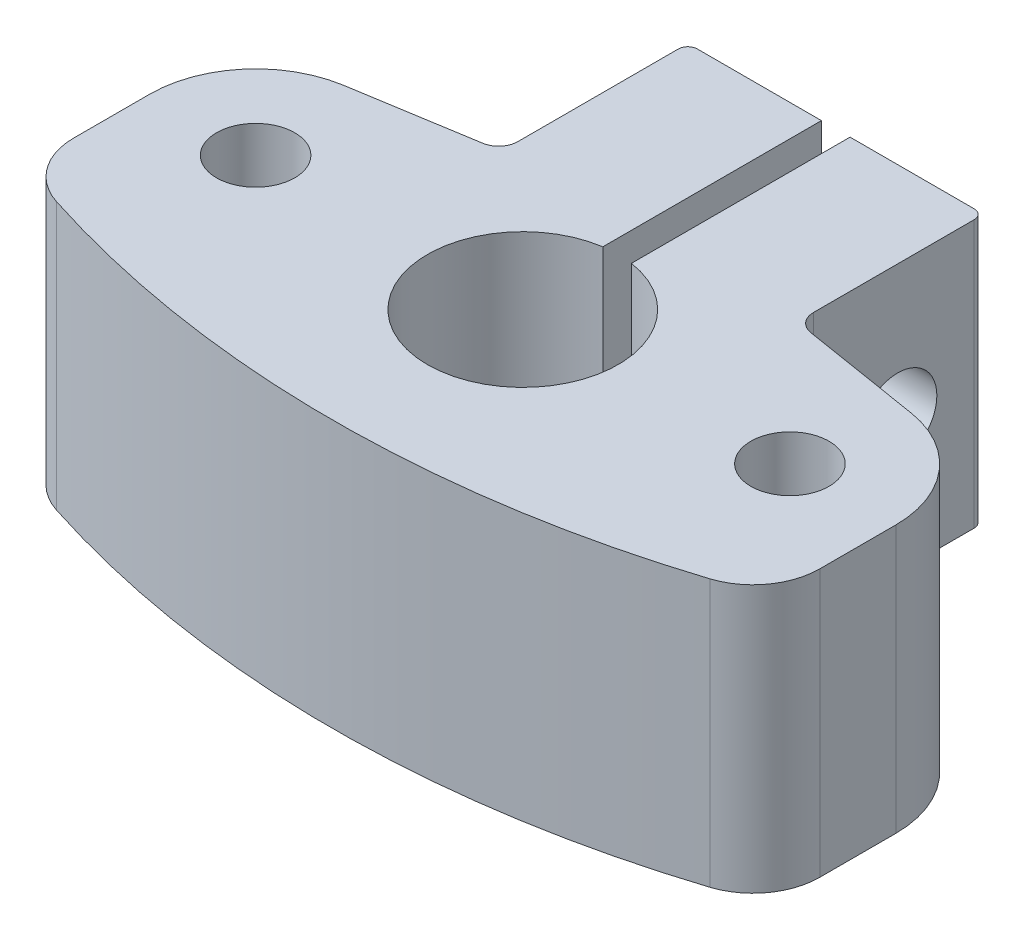
ISO-10303-21;
HEADER;
FILE_DESCRIPTION(('STEP AP214'),'2;1');
FILE_NAME('part.step','',(''),(''),'','','');
FILE_SCHEMA(('AUTOMOTIVE_DESIGN { 1 0 10303 214 1 1 1 1 }'));
ENDSEC;
DATA;
#1=APPLICATION_CONTEXT('core data for automotive mechanical design processes');
#2=APPLICATION_PROTOCOL_DEFINITION('international standard','automotive_design',2000,#1);
#3=PRODUCT_CONTEXT('',#1,'mechanical');
#4=PRODUCT('Part','Part','',(#3));
#5=PRODUCT_RELATED_PRODUCT_CATEGORY('part','',(#4));
#6=PRODUCT_DEFINITION_FORMATION('','',#4);
#7=PRODUCT_DEFINITION_CONTEXT('part definition',#1,'design');
#8=PRODUCT_DEFINITION('design','',#6,#7);
#9=PRODUCT_DEFINITION_SHAPE('','',#8);
#10=(LENGTH_UNIT() NAMED_UNIT(*) SI_UNIT(.MILLI.,.METRE.));
#11=(NAMED_UNIT(*) PLANE_ANGLE_UNIT() SI_UNIT($,.RADIAN.));
#12=(NAMED_UNIT(*) SI_UNIT($,.STERADIAN.) SOLID_ANGLE_UNIT());
#13=UNCERTAINTY_MEASURE_WITH_UNIT(LENGTH_MEASURE(1.E-05),#10,'distance_accuracy_value','');
#14=(GEOMETRIC_REPRESENTATION_CONTEXT(3) GLOBAL_UNCERTAINTY_ASSIGNED_CONTEXT((#13)) GLOBAL_UNIT_ASSIGNED_CONTEXT((#10,
#11,#12)) REPRESENTATION_CONTEXT('',''));
#15=CARTESIAN_POINT('',(0.,0.,0.));
#16=DIRECTION('',(0.,0.,1.));
#17=DIRECTION('',(1.,0.,0.));
#18=AXIS2_PLACEMENT_3D('',#15,#16,#17);
#19=CARTESIAN_POINT('',(-14.,14.,0.));
#20=DIRECTION('',(0.,1.,0.));
#21=DIRECTION('',(0.,0.,1.));
#22=AXIS2_PLACEMENT_3D('',#19,#20,#21);
#23=PLANE('',#22);
#24=CARTESIAN_POINT('',(-14.,14.,0.));
#25=DIRECTION('',(0.,1.,0.));
#26=DIRECTION('',(0.,0.,1.));
#27=AXIS2_PLACEMENT_3D('',#24,#25,#26);
#28=CIRCLE('',#27,2.05);
#29=CARTESIAN_POINT('',(-14.,14.,2.05));
#30=VERTEX_POINT('',#29);
#31=EDGE_CURVE('E213',#30,#30,#28,.T.);
#32=ORIENTED_EDGE('',*,*,#31,.F.);
#33=EDGE_LOOP('',(#32));
#34=FACE_BOUND('',#33,.T.);
#35=CARTESIAN_POINT('',(-14.,14.,0.));
#36=DIRECTION('',(0.,1.,0.));
#37=DIRECTION('',(0.,0.,1.));
#38=AXIS2_PLACEMENT_3D('',#35,#36,#37);
#39=CIRCLE('',#38,5.55);
#40=CARTESIAN_POINT('',(-14.8885534853354,14.,-5.47840968746391));
#41=VERTEX_POINT('',#40);
#42=CARTESIAN_POINT('',(-19.55,14.,0.));
#43=VERTEX_POINT('',#42);
#44=EDGE_CURVE('E246',#41,#43,#39,.T.);
#45=ORIENTED_EDGE('',*,*,#44,.T.);
#46=DIRECTION('',(0.,0.,1.));
#47=VECTOR('',#46,1.);
#48=CARTESIAN_POINT('',(-19.55,14.,0.));
#49=LINE('',#48,#47);
#50=CARTESIAN_POINT('',(-19.55,14.,3.98647317024878));
#51=VERTEX_POINT('',#50);
#52=EDGE_CURVE('E138',#43,#51,#49,.T.);
#53=ORIENTED_EDGE('',*,*,#52,.T.);
#54=CARTESIAN_POINT('',(-16.05,14.,3.98647317024878));
#55=DIRECTION('',(0.,1.,0.));
#56=DIRECTION('',(0.,0.,1.));
#57=AXIS2_PLACEMENT_3D('',#54,#55,#56);
#58=CIRCLE('',#57,3.5);
#59=CARTESIAN_POINT('',(-17.12,14.,7.31890471493203));
#60=VERTEX_POINT('',#59);
#61=EDGE_CURVE('E299',#51,#60,#58,.T.);
#62=ORIENTED_EDGE('',*,*,#61,.T.);
#63=CARTESIAN_POINT('',(0.,14.,-46.));
#64=DIRECTION('',(0.,1.,0.));
#65=DIRECTION('',(0.,0.,1.));
#66=AXIS2_PLACEMENT_3D('',#63,#64,#65);
#67=CIRCLE('',#66,56.);
#68=CARTESIAN_POINT('',(17.12,14.,7.31890471493202));
#69=VERTEX_POINT('',#68);
#70=EDGE_CURVE('E317',#60,#69,#67,.T.);
#71=ORIENTED_EDGE('',*,*,#70,.T.);
#72=CARTESIAN_POINT('',(16.05,14.,3.98647317024878));
#73=DIRECTION('',(0.,1.,0.));
#74=DIRECTION('',(0.,0.,-1.));
#75=AXIS2_PLACEMENT_3D('',#72,#73,#74);
#76=CIRCLE('',#75,3.5);
#77=CARTESIAN_POINT('',(19.55,14.,3.98647317024878));
#78=VERTEX_POINT('',#77);
#79=EDGE_CURVE('E316',#69,#78,#76,.T.);
#80=ORIENTED_EDGE('',*,*,#79,.T.);
#81=DIRECTION('',(0.,0.,-1.));
#82=VECTOR('',#81,1.);
#83=CARTESIAN_POINT('',(19.55,14.,0.));
#84=LINE('',#83,#82);
#85=CARTESIAN_POINT('',(19.55,14.,0.));
#86=VERTEX_POINT('',#85);
#87=EDGE_CURVE('E318',#78,#86,#84,.T.);
#88=ORIENTED_EDGE('',*,*,#87,.T.);
#89=CARTESIAN_POINT('',(14.,14.,0.));
#90=DIRECTION('',(0.,1.,0.));
#91=DIRECTION('',(0.,0.,1.));
#92=AXIS2_PLACEMENT_3D('',#89,#90,#91);
#93=CIRCLE('',#92,5.55);
#94=CARTESIAN_POINT('',(14.8885534853354,14.,-5.47840968746391));
#95=VERTEX_POINT('',#94);
#96=EDGE_CURVE('E321',#86,#95,#93,.T.);
#97=ORIENTED_EDGE('',*,*,#96,.T.);
#98=DIRECTION('',(-0.987100844588092,0.,-0.160099727087451));
#99=VECTOR('',#98,1.);
#100=CARTESIAN_POINT('',(14.8885534853354,14.,-5.47840968746391));
#101=LINE('',#100,#99);
#102=CARTESIAN_POINT('',(8.58990027291255,14.,-6.5));
#103=VERTEX_POINT('',#102);
#104=EDGE_CURVE('E330',#95,#103,#101,.T.);
#105=ORIENTED_EDGE('',*,*,#104,.T.);
#106=CARTESIAN_POINT('',(8.75,14.,-7.48710084458809));
#107=DIRECTION('',(0.,-1.,0.));
#108=DIRECTION('',(0.,0.,1.));
#109=AXIS2_PLACEMENT_3D('',#106,#107,#108);
#110=CIRCLE('',#109,1.);
#111=CARTESIAN_POINT('',(7.75,14.,-7.48710084458809));
#112=VERTEX_POINT('',#111);
#113=EDGE_CURVE('E328',#103,#112,#110,.T.);
#114=ORIENTED_EDGE('',*,*,#113,.T.);
#115=DIRECTION('',(0.,0.,-1.));
#116=VECTOR('',#115,1.);
#117=CARTESIAN_POINT('',(7.75,14.,-7.48710084458809));
#118=LINE('',#117,#116);
#119=CARTESIAN_POINT('',(7.75,14.,-15.9));
#120=VERTEX_POINT('',#119);
#121=EDGE_CURVE('E332',#112,#120,#118,.T.);
#122=ORIENTED_EDGE('',*,*,#121,.T.);
#123=CARTESIAN_POINT('',(7.25,14.,-15.9));
#124=DIRECTION('',(0.,1.,0.));
#125=DIRECTION('',(0.,0.,1.));
#126=AXIS2_PLACEMENT_3D('',#123,#124,#125);
#127=CIRCLE('',#126,0.5);
#128=CARTESIAN_POINT('',(7.25,14.,-16.4));
#129=VERTEX_POINT('',#128);
#130=EDGE_CURVE('E334',#120,#129,#127,.T.);
#131=ORIENTED_EDGE('',*,*,#130,.T.);
#132=DIRECTION('',(-1.,0.,0.));
#133=VECTOR('',#132,1.);
#134=CARTESIAN_POINT('',(0.75,14.,-16.4));
#135=LINE('',#134,#133);
#136=CARTESIAN_POINT('',(0.75,14.,-16.4));
#137=VERTEX_POINT('',#136);
#138=EDGE_CURVE('E333',#129,#137,#135,.T.);
#139=ORIENTED_EDGE('',*,*,#138,.T.);
#140=DIRECTION('',(0.,0.,1.));
#141=VECTOR('',#140,1.);
#142=CARTESIAN_POINT('',(0.75,14.,-4.9434299833213));
#143=LINE('',#142,#141);
#144=CARTESIAN_POINT('',(0.75,14.,-4.9434299833213));
#145=VERTEX_POINT('',#144);
#146=EDGE_CURVE('E340',#137,#145,#143,.T.);
#147=ORIENTED_EDGE('',*,*,#146,.T.);
#148=CARTESIAN_POINT('',(0.,14.,0.));
#149=DIRECTION('',(0.,-1.,0.));
#150=DIRECTION('',(0.,0.,1.));
#151=AXIS2_PLACEMENT_3D('',#148,#149,#150);
#152=CIRCLE('',#151,5.);
#153=CARTESIAN_POINT('',(-0.749999999999999,14.,-4.9434299833213));
#154=VERTEX_POINT('',#153);
#155=EDGE_CURVE('E338',#145,#154,#152,.T.);
#156=ORIENTED_EDGE('',*,*,#155,.T.);
#157=DIRECTION('',(0.,0.,-1.));
#158=VECTOR('',#157,1.);
#159=CARTESIAN_POINT('',(-0.75,14.,-4.9434299833213));
#160=LINE('',#159,#158);
#161=CARTESIAN_POINT('',(-0.75,14.,-16.4));
#162=VERTEX_POINT('',#161);
#163=EDGE_CURVE('E343',#154,#162,#160,.T.);
#164=ORIENTED_EDGE('',*,*,#163,.T.);
#165=DIRECTION('',(-1.,0.,0.));
#166=VECTOR('',#165,1.);
#167=CARTESIAN_POINT('',(-7.25,14.,-16.4));
#168=LINE('',#167,#166);
#169=CARTESIAN_POINT('',(-7.25,14.,-16.4));
#170=VERTEX_POINT('',#169);
#171=EDGE_CURVE('E341',#162,#170,#168,.T.);
#172=ORIENTED_EDGE('',*,*,#171,.T.);
#173=CARTESIAN_POINT('',(-7.25,14.,-15.9));
#174=DIRECTION('',(0.,1.,0.));
#175=DIRECTION('',(0.,0.,1.));
#176=AXIS2_PLACEMENT_3D('',#173,#174,#175);
#177=CIRCLE('',#176,0.5);
#178=CARTESIAN_POINT('',(-7.75,14.,-15.9));
#179=VERTEX_POINT('',#178);
#180=EDGE_CURVE('E193',#170,#179,#177,.T.);
#181=ORIENTED_EDGE('',*,*,#180,.T.);
#182=DIRECTION('',(0.,0.,1.));
#183=VECTOR('',#182,1.);
#184=CARTESIAN_POINT('',(-7.75,14.,-7.48710084458809));
#185=LINE('',#184,#183);
#186=CARTESIAN_POINT('',(-7.75,14.,-7.48710084458809));
#187=VERTEX_POINT('',#186);
#188=EDGE_CURVE('E183',#179,#187,#185,.T.);
#189=ORIENTED_EDGE('',*,*,#188,.T.);
#190=CARTESIAN_POINT('',(-8.75,14.,-7.48710084458809));
#191=DIRECTION('',(0.,-1.,0.));
#192=DIRECTION('',(0.,0.,-1.));
#193=AXIS2_PLACEMENT_3D('',#190,#191,#192);
#194=CIRCLE('',#193,1.);
#195=CARTESIAN_POINT('',(-8.58990027291255,14.,-6.5));
#196=VERTEX_POINT('',#195);
#197=EDGE_CURVE('E188',#187,#196,#194,.T.);
#198=ORIENTED_EDGE('',*,*,#197,.T.);
#199=DIRECTION('',(-0.987100844588092,0.,0.160099727087451));
#200=VECTOR('',#199,1.);
#201=CARTESIAN_POINT('',(-14.8885534853354,14.,-5.47840968746391));
#202=LINE('',#201,#200);
#203=EDGE_CURVE('E60',#196,#41,#202,.T.);
#204=ORIENTED_EDGE('',*,*,#203,.T.);
#205=EDGE_LOOP('',(#45,#53,#62,#71,#80,#88,#97,#105,#114,#122,#131,#139,#147,#156,#164,#172,
#181,#189,#198,#204));
#206=FACE_BOUND('',#205,.T.);
#207=CARTESIAN_POINT('',(14.,14.,0.));
#208=DIRECTION('',(0.,1.,0.));
#209=DIRECTION('',(0.,0.,1.));
#210=AXIS2_PLACEMENT_3D('',#207,#208,#209);
#211=CIRCLE('',#210,2.05);
#212=CARTESIAN_POINT('',(14.,14.,2.05));
#213=VERTEX_POINT('',#212);
#214=EDGE_CURVE('E402',#213,#213,#211,.T.);
#215=ORIENTED_EDGE('',*,*,#214,.F.);
#216=EDGE_LOOP('',(#215));
#217=FACE_BOUND('',#216,.T.);
#218=ADVANCED_FACE('F39',(#34,#206,#217),#23,.T.);
#219=CARTESIAN_POINT('',(-14.,0.,0.));
#220=DIRECTION('',(0.,1.,0.));
#221=DIRECTION('',(0.,0.,1.));
#222=AXIS2_PLACEMENT_3D('',#219,#220,#221);
#223=PLANE('',#222);
#224=CARTESIAN_POINT('',(-14.,0.,0.));
#225=DIRECTION('',(0.,1.,0.));
#226=DIRECTION('',(0.,0.,1.));
#227=AXIS2_PLACEMENT_3D('',#224,#225,#226);
#228=CIRCLE('',#227,5.55);
#229=CARTESIAN_POINT('',(-14.8885534853354,0.,-5.47840968746391));
#230=VERTEX_POINT('',#229);
#231=CARTESIAN_POINT('',(-19.55,0.,0.));
#232=VERTEX_POINT('',#231);
#233=EDGE_CURVE('E207',#230,#232,#228,.T.);
#234=ORIENTED_EDGE('',*,*,#233,.F.);
#235=DIRECTION('',(-0.987100844588092,0.,0.160099727087451));
#236=VECTOR('',#235,1.);
#237=CARTESIAN_POINT('',(-14.8885534853354,0.,-5.47840968746391));
#238=LINE('',#237,#236);
#239=CARTESIAN_POINT('',(-8.58990027291255,0.,-6.5));
#240=VERTEX_POINT('',#239);
#241=EDGE_CURVE('E126',#240,#230,#238,.T.);
#242=ORIENTED_EDGE('',*,*,#241,.F.);
#243=CARTESIAN_POINT('',(-8.75,0.,-7.48710084458809));
#244=DIRECTION('',(0.,-1.,0.));
#245=DIRECTION('',(0.,0.,-1.));
#246=AXIS2_PLACEMENT_3D('',#243,#244,#245);
#247=CIRCLE('',#246,1.);
#248=CARTESIAN_POINT('',(-7.75,0.,-7.48710084458809));
#249=VERTEX_POINT('',#248);
#250=EDGE_CURVE('E125',#249,#240,#247,.T.);
#251=ORIENTED_EDGE('',*,*,#250,.F.);
#252=DIRECTION('',(0.,0.,1.));
#253=VECTOR('',#252,1.);
#254=CARTESIAN_POINT('',(-7.75,0.,-7.48710084458809));
#255=LINE('',#254,#253);
#256=CARTESIAN_POINT('',(-7.75,0.,-15.9));
#257=VERTEX_POINT('',#256);
#258=EDGE_CURVE('E200',#257,#249,#255,.T.);
#259=ORIENTED_EDGE('',*,*,#258,.F.);
#260=CARTESIAN_POINT('',(-7.25,0.,-15.9));
#261=DIRECTION('',(0.,1.,0.));
#262=DIRECTION('',(0.,0.,1.));
#263=AXIS2_PLACEMENT_3D('',#260,#261,#262);
#264=CIRCLE('',#263,0.5);
#265=CARTESIAN_POINT('',(-7.25,0.,-16.4));
#266=VERTEX_POINT('',#265);
#267=EDGE_CURVE('E242',#266,#257,#264,.T.);
#268=ORIENTED_EDGE('',*,*,#267,.F.);
#269=DIRECTION('',(-1.,0.,0.));
#270=VECTOR('',#269,1.);
#271=CARTESIAN_POINT('',(-7.25,0.,-16.4));
#272=LINE('',#271,#270);
#273=CARTESIAN_POINT('',(-0.75,0.,-16.4));
#274=VERTEX_POINT('',#273);
#275=EDGE_CURVE('E241',#274,#266,#272,.T.);
#276=ORIENTED_EDGE('',*,*,#275,.F.);
#277=DIRECTION('',(0.,0.,-1.));
#278=VECTOR('',#277,1.);
#279=CARTESIAN_POINT('',(-0.75,0.,-4.9434299833213));
#280=LINE('',#279,#278);
#281=CARTESIAN_POINT('',(-0.749999999999999,0.,-4.9434299833213));
#282=VERTEX_POINT('',#281);
#283=EDGE_CURVE('E239',#282,#274,#280,.T.);
#284=ORIENTED_EDGE('',*,*,#283,.F.);
#285=CARTESIAN_POINT('',(0.,0.,0.));
#286=DIRECTION('',(0.,-1.,0.));
#287=DIRECTION('',(0.,0.,1.));
#288=AXIS2_PLACEMENT_3D('',#285,#286,#287);
#289=CIRCLE('',#288,5.);
#290=CARTESIAN_POINT('',(0.75,0.,-4.9434299833213));
#291=VERTEX_POINT('',#290);
#292=EDGE_CURVE('E240',#291,#282,#289,.T.);
#293=ORIENTED_EDGE('',*,*,#292,.F.);
#294=DIRECTION('',(0.,0.,1.));
#295=VECTOR('',#294,1.);
#296=CARTESIAN_POINT('',(0.75,0.,-4.9434299833213));
#297=LINE('',#296,#295);
#298=CARTESIAN_POINT('',(0.75,0.,-16.4));
#299=VERTEX_POINT('',#298);
#300=EDGE_CURVE('E234',#299,#291,#297,.T.);
#301=ORIENTED_EDGE('',*,*,#300,.F.);
#302=DIRECTION('',(-1.,0.,0.));
#303=VECTOR('',#302,1.);
#304=CARTESIAN_POINT('',(0.75,0.,-16.4));
#305=LINE('',#304,#303);
#306=CARTESIAN_POINT('',(7.25,0.,-16.4));
#307=VERTEX_POINT('',#306);
#308=EDGE_CURVE('E231',#307,#299,#305,.T.);
#309=ORIENTED_EDGE('',*,*,#308,.F.);
#310=CARTESIAN_POINT('',(7.25,0.,-15.9));
#311=DIRECTION('',(0.,1.,0.));
#312=DIRECTION('',(0.,0.,1.));
#313=AXIS2_PLACEMENT_3D('',#310,#311,#312);
#314=CIRCLE('',#313,0.5);
#315=CARTESIAN_POINT('',(7.75,0.,-15.9));
#316=VERTEX_POINT('',#315);
#317=EDGE_CURVE('E233',#316,#307,#314,.T.);
#318=ORIENTED_EDGE('',*,*,#317,.F.);
#319=DIRECTION('',(0.,0.,-1.));
#320=VECTOR('',#319,1.);
#321=CARTESIAN_POINT('',(7.75,0.,-7.48710084458809));
#322=LINE('',#321,#320);
#323=CARTESIAN_POINT('',(7.75,0.,-7.48710084458809));
#324=VERTEX_POINT('',#323);
#325=EDGE_CURVE('E228',#324,#316,#322,.T.);
#326=ORIENTED_EDGE('',*,*,#325,.F.);
#327=CARTESIAN_POINT('',(8.75,0.,-7.48710084458809));
#328=DIRECTION('',(0.,-1.,0.));
#329=DIRECTION('',(0.,0.,1.));
#330=AXIS2_PLACEMENT_3D('',#327,#328,#329);
#331=CIRCLE('',#330,1.);
#332=CARTESIAN_POINT('',(8.58990027291255,0.,-6.5));
#333=VERTEX_POINT('',#332);
#334=EDGE_CURVE('E230',#333,#324,#331,.T.);
#335=ORIENTED_EDGE('',*,*,#334,.F.);
#336=DIRECTION('',(-0.987100844588092,0.,-0.160099727087451));
#337=VECTOR('',#336,1.);
#338=CARTESIAN_POINT('',(14.8885534853354,0.,-5.47840968746391));
#339=LINE('',#338,#337);
#340=CARTESIAN_POINT('',(14.8885534853354,0.,-5.47840968746391));
#341=VERTEX_POINT('',#340);
#342=EDGE_CURVE('E223',#341,#333,#339,.T.);
#343=ORIENTED_EDGE('',*,*,#342,.F.);
#344=CARTESIAN_POINT('',(14.,0.,0.));
#345=DIRECTION('',(0.,1.,0.));
#346=DIRECTION('',(0.,0.,1.));
#347=AXIS2_PLACEMENT_3D('',#344,#345,#346);
#348=CIRCLE('',#347,5.55);
#349=CARTESIAN_POINT('',(19.55,0.,0.));
#350=VERTEX_POINT('',#349);
#351=EDGE_CURVE('E224',#350,#341,#348,.T.);
#352=ORIENTED_EDGE('',*,*,#351,.F.);
#353=DIRECTION('',(0.,0.,-1.));
#354=VECTOR('',#353,1.);
#355=CARTESIAN_POINT('',(19.55,0.,0.));
#356=LINE('',#355,#354);
#357=CARTESIAN_POINT('',(19.55,0.,3.98647317024878));
#358=VERTEX_POINT('',#357);
#359=EDGE_CURVE('E222',#358,#350,#356,.T.);
#360=ORIENTED_EDGE('',*,*,#359,.F.);
#361=CARTESIAN_POINT('',(16.05,0.,3.98647317024878));
#362=DIRECTION('',(0.,1.,0.));
#363=DIRECTION('',(0.,0.,-1.));
#364=AXIS2_PLACEMENT_3D('',#361,#362,#363);
#365=CIRCLE('',#364,3.5);
#366=CARTESIAN_POINT('',(17.12,0.,7.31890471493202));
#367=VERTEX_POINT('',#366);
#368=EDGE_CURVE('E218',#367,#358,#365,.T.);
#369=ORIENTED_EDGE('',*,*,#368,.F.);
#370=CARTESIAN_POINT('',(0.,0.,-46.));
#371=DIRECTION('',(0.,1.,0.));
#372=DIRECTION('',(0.,0.,1.));
#373=AXIS2_PLACEMENT_3D('',#370,#371,#372);
#374=CIRCLE('',#373,56.);
#375=CARTESIAN_POINT('',(-17.12,0.,7.31890471493203));
#376=VERTEX_POINT('',#375);
#377=EDGE_CURVE('E220',#376,#367,#374,.T.);
#378=ORIENTED_EDGE('',*,*,#377,.F.);
#379=CARTESIAN_POINT('',(-16.05,0.,3.98647317024878));
#380=DIRECTION('',(0.,1.,0.));
#381=DIRECTION('',(0.,0.,1.));
#382=AXIS2_PLACEMENT_3D('',#379,#380,#381);
#383=CIRCLE('',#382,3.5);
#384=CARTESIAN_POINT('',(-19.55,0.,3.98647317024878));
#385=VERTEX_POINT('',#384);
#386=EDGE_CURVE('E214',#385,#376,#383,.T.);
#387=ORIENTED_EDGE('',*,*,#386,.F.);
#388=DIRECTION('',(0.,0.,1.));
#389=VECTOR('',#388,1.);
#390=CARTESIAN_POINT('',(-19.55,0.,0.));
#391=LINE('',#390,#389);
#392=EDGE_CURVE('E215',#232,#385,#391,.T.);
#393=ORIENTED_EDGE('',*,*,#392,.F.);
#394=EDGE_LOOP('',(#234,#242,#251,#259,#268,#276,#284,#293,#301,#309,#318,#326,#335,#343,#352,
#360,#369,#378,#387,#393));
#395=FACE_BOUND('',#394,.T.);
#396=CARTESIAN_POINT('',(-14.,0.,0.));
#397=DIRECTION('',(0.,1.,0.));
#398=DIRECTION('',(0.,0.,1.));
#399=AXIS2_PLACEMENT_3D('',#396,#397,#398);
#400=CIRCLE('',#399,2.05);
#401=CARTESIAN_POINT('',(-14.,0.,2.05));
#402=VERTEX_POINT('',#401);
#403=EDGE_CURVE('E407',#402,#402,#400,.T.);
#404=ORIENTED_EDGE('',*,*,#403,.T.);
#405=EDGE_LOOP('',(#404));
#406=FACE_BOUND('',#405,.T.);
#407=CARTESIAN_POINT('',(14.,0.,0.));
#408=DIRECTION('',(0.,1.,0.));
#409=DIRECTION('',(0.,0.,1.));
#410=AXIS2_PLACEMENT_3D('',#407,#408,#409);
#411=CIRCLE('',#410,2.05);
#412=CARTESIAN_POINT('',(14.,0.,2.05));
#413=VERTEX_POINT('',#412);
#414=EDGE_CURVE('E400',#413,#413,#411,.T.);
#415=ORIENTED_EDGE('',*,*,#414,.T.);
#416=EDGE_LOOP('',(#415));
#417=FACE_BOUND('',#416,.T.);
#418=ADVANCED_FACE('F302',(#395,#406,#417),#223,.F.);
#419=CARTESIAN_POINT('',(-14.,14.,0.));
#420=DIRECTION('',(0.,-1.,0.));
#421=DIRECTION('',(0.,0.,-1.));
#422=AXIS2_PLACEMENT_3D('',#419,#420,#421);
#423=CYLINDRICAL_SURFACE('',#422,5.55);
#424=ORIENTED_EDGE('',*,*,#233,.T.);
#425=DIRECTION('',(0.,-1.,0.));
#426=VECTOR('',#425,1.);
#427=CARTESIAN_POINT('',(-19.55,14.,0.));
#428=LINE('',#427,#426);
#429=EDGE_CURVE('E11',#43,#232,#428,.T.);
#430=ORIENTED_EDGE('',*,*,#429,.F.);
#431=ORIENTED_EDGE('',*,*,#44,.F.);
#432=DIRECTION('',(0.,-1.,0.));
#433=VECTOR('',#432,1.);
#434=CARTESIAN_POINT('',(-14.8885534853354,14.,-5.47840968746391));
#435=LINE('',#434,#433);
#436=EDGE_CURVE('E202',#41,#230,#435,.T.);
#437=ORIENTED_EDGE('',*,*,#436,.T.);
#438=EDGE_LOOP('',(#424,#430,#431,#437));
#439=FACE_BOUND('',#438,.T.);
#440=ADVANCED_FACE('F41',(#439),#423,.T.);
#441=CARTESIAN_POINT('',(-19.55,14.,0.));
#442=DIRECTION('',(1.,0.,0.));
#443=DIRECTION('',(0.,0.,-1.));
#444=AXIS2_PLACEMENT_3D('',#441,#442,#443);
#445=PLANE('',#444);
#446=ORIENTED_EDGE('',*,*,#392,.T.);
#447=DIRECTION('',(0.,-1.,0.));
#448=VECTOR('',#447,1.);
#449=CARTESIAN_POINT('',(-19.55,14.,3.98647317024878));
#450=LINE('',#449,#448);
#451=EDGE_CURVE('E47',#51,#385,#450,.T.);
#452=ORIENTED_EDGE('',*,*,#451,.F.);
#453=ORIENTED_EDGE('',*,*,#52,.F.);
#454=ORIENTED_EDGE('',*,*,#429,.T.);
#455=EDGE_LOOP('',(#446,#452,#453,#454));
#456=FACE_BOUND('',#455,.T.);
#457=ADVANCED_FACE('F488',(#456),#445,.F.);
#458=CARTESIAN_POINT('',(-16.05,14.,3.98647317024878));
#459=DIRECTION('',(0.,-1.,0.));
#460=DIRECTION('',(0.,0.,-1.));
#461=AXIS2_PLACEMENT_3D('',#458,#459,#460);
#462=CYLINDRICAL_SURFACE('',#461,3.5);
#463=ORIENTED_EDGE('',*,*,#386,.T.);
#464=DIRECTION('',(0.,-1.,0.));
#465=VECTOR('',#464,1.);
#466=CARTESIAN_POINT('',(-17.12,14.,7.31890471493203));
#467=LINE('',#466,#465);
#468=EDGE_CURVE('E292',#60,#376,#467,.T.);
#469=ORIENTED_EDGE('',*,*,#468,.F.);
#470=ORIENTED_EDGE('',*,*,#61,.F.);
#471=ORIENTED_EDGE('',*,*,#451,.T.);
#472=EDGE_LOOP('',(#463,#469,#470,#471));
#473=FACE_BOUND('',#472,.T.);
#474=ADVANCED_FACE('F297',(#473),#462,.T.);
#475=CARTESIAN_POINT('',(0.,14.,-46.));
#476=DIRECTION('',(0.,-1.,0.));
#477=DIRECTION('',(0.,0.,-1.));
#478=AXIS2_PLACEMENT_3D('',#475,#476,#477);
#479=CYLINDRICAL_SURFACE('',#478,56.);
#480=ORIENTED_EDGE('',*,*,#377,.T.);
#481=DIRECTION('',(0.,-1.,0.));
#482=VECTOR('',#481,1.);
#483=CARTESIAN_POINT('',(17.12,14.,7.31890471493202));
#484=LINE('',#483,#482);
#485=EDGE_CURVE('E286',#69,#367,#484,.T.);
#486=ORIENTED_EDGE('',*,*,#485,.F.);
#487=ORIENTED_EDGE('',*,*,#70,.F.);
#488=ORIENTED_EDGE('',*,*,#468,.T.);
#489=EDGE_LOOP('',(#480,#486,#487,#488));
#490=FACE_BOUND('',#489,.T.);
#491=ADVANCED_FACE('F309',(#490),#479,.T.);
#492=CARTESIAN_POINT('',(16.05,14.,3.98647317024878));
#493=DIRECTION('',(0.,-1.,0.));
#494=DIRECTION('',(0.,0.,-1.));
#495=AXIS2_PLACEMENT_3D('',#492,#493,#494);
#496=CYLINDRICAL_SURFACE('',#495,3.5);
#497=ORIENTED_EDGE('',*,*,#368,.T.);
#498=DIRECTION('',(0.,-1.,0.));
#499=VECTOR('',#498,1.);
#500=CARTESIAN_POINT('',(19.55,14.,3.98647317024878));
#501=LINE('',#500,#499);
#502=EDGE_CURVE('E284',#78,#358,#501,.T.);
#503=ORIENTED_EDGE('',*,*,#502,.F.);
#504=ORIENTED_EDGE('',*,*,#79,.F.);
#505=ORIENTED_EDGE('',*,*,#485,.T.);
#506=EDGE_LOOP('',(#497,#503,#504,#505));
#507=FACE_BOUND('',#506,.T.);
#508=ADVANCED_FACE('F314',(#507),#496,.T.);
#509=CARTESIAN_POINT('',(19.55,14.,0.));
#510=DIRECTION('',(-1.,0.,0.));
#511=DIRECTION('',(0.,0.,1.));
#512=AXIS2_PLACEMENT_3D('',#509,#510,#511);
#513=PLANE('',#512);
#514=ORIENTED_EDGE('',*,*,#359,.T.);
#515=DIRECTION('',(0.,-1.,0.));
#516=VECTOR('',#515,1.);
#517=CARTESIAN_POINT('',(19.55,14.,0.));
#518=LINE('',#517,#516);
#519=EDGE_CURVE('E285',#86,#350,#518,.T.);
#520=ORIENTED_EDGE('',*,*,#519,.F.);
#521=ORIENTED_EDGE('',*,*,#87,.F.);
#522=ORIENTED_EDGE('',*,*,#502,.T.);
#523=EDGE_LOOP('',(#514,#520,#521,#522));
#524=FACE_BOUND('',#523,.T.);
#525=ADVANCED_FACE('F475',(#524),#513,.F.);
#526=CARTESIAN_POINT('',(14.,14.,0.));
#527=DIRECTION('',(0.,-1.,0.));
#528=DIRECTION('',(0.,0.,-1.));
#529=AXIS2_PLACEMENT_3D('',#526,#527,#528);
#530=CYLINDRICAL_SURFACE('',#529,5.55);
#531=ORIENTED_EDGE('',*,*,#351,.T.);
#532=DIRECTION('',(0.,-1.,0.));
#533=VECTOR('',#532,1.);
#534=CARTESIAN_POINT('',(14.8885534853354,14.,-5.47840968746391));
#535=LINE('',#534,#533);
#536=EDGE_CURVE('E276',#95,#341,#535,.T.);
#537=ORIENTED_EDGE('',*,*,#536,.F.);
#538=ORIENTED_EDGE('',*,*,#96,.F.);
#539=ORIENTED_EDGE('',*,*,#519,.T.);
#540=EDGE_LOOP('',(#531,#537,#538,#539));
#541=FACE_BOUND('',#540,.T.);
#542=ADVANCED_FACE('F473',(#541),#530,.T.);
#543=CARTESIAN_POINT('',(14.8885534853354,14.,-5.47840968746391));
#544=DIRECTION('',(-0.160099727087451,0.,0.987100844588092));
#545=DIRECTION('',(0.987100844588092,0.,0.160099727087451));
#546=AXIS2_PLACEMENT_3D('',#543,#544,#545);
#547=PLANE('',#546);
#548=ORIENTED_EDGE('',*,*,#342,.T.);
#549=DIRECTION('',(0.,-1.,0.));
#550=VECTOR('',#549,1.);
#551=CARTESIAN_POINT('',(8.58990027291255,14.,-6.5));
#552=LINE('',#551,#550);
#553=EDGE_CURVE('E277',#103,#333,#552,.T.);
#554=ORIENTED_EDGE('',*,*,#553,.F.);
#555=ORIENTED_EDGE('',*,*,#104,.F.);
#556=ORIENTED_EDGE('',*,*,#536,.T.);
#557=EDGE_LOOP('',(#548,#554,#555,#556));
#558=FACE_BOUND('',#557,.T.);
#559=ADVANCED_FACE('F468',(#558),#547,.F.);
#560=CARTESIAN_POINT('',(8.75,14.,-7.48710084458809));
#561=DIRECTION('',(0.,-1.,0.));
#562=DIRECTION('',(0.,0.,-1.));
#563=AXIS2_PLACEMENT_3D('',#560,#561,#562);
#564=CYLINDRICAL_SURFACE('',#563,1.);
#565=ORIENTED_EDGE('',*,*,#334,.T.);
#566=DIRECTION('',(0.,-1.,0.));
#567=VECTOR('',#566,1.);
#568=CARTESIAN_POINT('',(7.75,14.,-7.48710084458809));
#569=LINE('',#568,#567);
#570=EDGE_CURVE('E272',#112,#324,#569,.T.);
#571=ORIENTED_EDGE('',*,*,#570,.F.);
#572=ORIENTED_EDGE('',*,*,#113,.F.);
#573=ORIENTED_EDGE('',*,*,#553,.T.);
#574=EDGE_LOOP('',(#565,#571,#572,#573));
#575=FACE_BOUND('',#574,.T.);
#576=ADVANCED_FACE('F461',(#575),#564,.F.);
#577=CARTESIAN_POINT('',(7.75,14.,-7.48710084458809));
#578=DIRECTION('',(-1.,0.,0.));
#579=DIRECTION('',(0.,0.,1.));
#580=AXIS2_PLACEMENT_3D('',#577,#578,#579);
#581=PLANE('',#580);
#582=CARTESIAN_POINT('',(7.75,7.,-11.9));
#583=DIRECTION('',(1.,0.,0.));
#584=DIRECTION('',(0.,0.,-1.));
#585=AXIS2_PLACEMENT_3D('',#582,#583,#584);
#586=CIRCLE('',#585,2.05);
#587=CARTESIAN_POINT('',(7.75,7.,-13.95));
#588=VERTEX_POINT('',#587);
#589=EDGE_CURVE('E395',#588,#588,#586,.T.);
#590=ORIENTED_EDGE('',*,*,#589,.F.);
#591=EDGE_LOOP('',(#590));
#592=FACE_BOUND('',#591,.T.);
#593=ORIENTED_EDGE('',*,*,#325,.T.);
#594=DIRECTION('',(0.,-1.,0.));
#595=VECTOR('',#594,1.);
#596=CARTESIAN_POINT('',(7.75,14.,-15.9));
#597=LINE('',#596,#595);
#598=EDGE_CURVE('E269',#120,#316,#597,.T.);
#599=ORIENTED_EDGE('',*,*,#598,.F.);
#600=ORIENTED_EDGE('',*,*,#121,.F.);
#601=ORIENTED_EDGE('',*,*,#570,.T.);
#602=EDGE_LOOP('',(#593,#599,#600,#601));
#603=FACE_BOUND('',#602,.T.);
#604=ADVANCED_FACE('F460',(#592,#603),#581,.F.);
#605=CARTESIAN_POINT('',(7.25,14.,-15.9));
#606=DIRECTION('',(0.,-1.,0.));
#607=DIRECTION('',(0.,0.,-1.));
#608=AXIS2_PLACEMENT_3D('',#605,#606,#607);
#609=CYLINDRICAL_SURFACE('',#608,0.5);
#610=ORIENTED_EDGE('',*,*,#317,.T.);
#611=DIRECTION('',(0.,-1.,0.));
#612=VECTOR('',#611,1.);
#613=CARTESIAN_POINT('',(7.25,14.,-16.4));
#614=LINE('',#613,#612);
#615=EDGE_CURVE('E270',#129,#307,#614,.T.);
#616=ORIENTED_EDGE('',*,*,#615,.F.);
#617=ORIENTED_EDGE('',*,*,#130,.F.);
#618=ORIENTED_EDGE('',*,*,#598,.T.);
#619=EDGE_LOOP('',(#610,#616,#617,#618));
#620=FACE_BOUND('',#619,.T.);
#621=ADVANCED_FACE('F455',(#620),#609,.T.);
#622=CARTESIAN_POINT('',(0.75,14.,-16.4));
#623=DIRECTION('',(0.,0.,1.));
#624=DIRECTION('',(1.,0.,0.));
#625=AXIS2_PLACEMENT_3D('',#622,#623,#624);
#626=PLANE('',#625);
#627=ORIENTED_EDGE('',*,*,#308,.T.);
#628=DIRECTION('',(0.,-1.,0.));
#629=VECTOR('',#628,1.);
#630=CARTESIAN_POINT('',(0.75,14.,-16.4));
#631=LINE('',#630,#629);
#632=EDGE_CURVE('E262',#137,#299,#631,.T.);
#633=ORIENTED_EDGE('',*,*,#632,.F.);
#634=ORIENTED_EDGE('',*,*,#138,.F.);
#635=ORIENTED_EDGE('',*,*,#615,.T.);
#636=EDGE_LOOP('',(#627,#633,#634,#635));
#637=FACE_BOUND('',#636,.T.);
#638=ADVANCED_FACE('F446',(#637),#626,.F.);
#639=CARTESIAN_POINT('',(0.75,14.,-4.9434299833213));
#640=DIRECTION('',(1.,0.,0.));
#641=DIRECTION('',(0.,0.,-1.));
#642=AXIS2_PLACEMENT_3D('',#639,#640,#641);
#643=PLANE('',#642);
#644=CARTESIAN_POINT('',(0.750000000000001,7.,-11.9));
#645=DIRECTION('',(1.,0.,0.));
#646=DIRECTION('',(0.,0.,-1.));
#647=AXIS2_PLACEMENT_3D('',#644,#645,#646);
#648=CIRCLE('',#647,2.05);
#649=CARTESIAN_POINT('',(0.750000000000001,7.,-13.95));
#650=VERTEX_POINT('',#649);
#651=EDGE_CURVE('E394',#650,#650,#648,.T.);
#652=ORIENTED_EDGE('',*,*,#651,.T.);
#653=EDGE_LOOP('',(#652));
#654=FACE_BOUND('',#653,.T.);
#655=ORIENTED_EDGE('',*,*,#300,.T.);
#656=DIRECTION('',(0.,-1.,0.));
#657=VECTOR('',#656,1.);
#658=CARTESIAN_POINT('',(0.75,14.,-4.9434299833213));
#659=LINE('',#658,#657);
#660=EDGE_CURVE('E261',#145,#291,#659,.T.);
#661=ORIENTED_EDGE('',*,*,#660,.F.);
#662=ORIENTED_EDGE('',*,*,#146,.F.);
#663=ORIENTED_EDGE('',*,*,#632,.T.);
#664=EDGE_LOOP('',(#655,#661,#662,#663));
#665=FACE_BOUND('',#664,.T.);
#666=ADVANCED_FACE('F445',(#654,#665),#643,.F.);
#667=CARTESIAN_POINT('',(0.,14.,0.));
#668=DIRECTION('',(0.,-1.,0.));
#669=DIRECTION('',(0.,0.,-1.));
#670=AXIS2_PLACEMENT_3D('',#667,#668,#669);
#671=CYLINDRICAL_SURFACE('',#670,5.);
#672=ORIENTED_EDGE('',*,*,#292,.T.);
#673=DIRECTION('',(0.,-1.,0.));
#674=VECTOR('',#673,1.);
#675=CARTESIAN_POINT('',(-0.749999999999999,14.,-4.9434299833213));
#676=LINE('',#675,#674);
#677=EDGE_CURVE('E256',#154,#282,#676,.T.);
#678=ORIENTED_EDGE('',*,*,#677,.F.);
#679=ORIENTED_EDGE('',*,*,#155,.F.);
#680=ORIENTED_EDGE('',*,*,#660,.T.);
#681=EDGE_LOOP('',(#672,#678,#679,#680));
#682=FACE_BOUND('',#681,.T.);
#683=ADVANCED_FACE('F429',(#682),#671,.F.);
#684=CARTESIAN_POINT('',(-0.75,14.,-4.9434299833213));
#685=DIRECTION('',(-1.,0.,0.));
#686=DIRECTION('',(0.,0.,1.));
#687=AXIS2_PLACEMENT_3D('',#684,#685,#686);
#688=PLANE('',#687);
#689=CARTESIAN_POINT('',(-0.750000000000001,7.,-11.9));
#690=DIRECTION('',(-1.,0.,0.));
#691=DIRECTION('',(0.,0.,1.));
#692=AXIS2_PLACEMENT_3D('',#689,#690,#691);
#693=CIRCLE('',#692,2.05);
#694=CARTESIAN_POINT('',(-0.750000000000001,7.,-9.85));
#695=VERTEX_POINT('',#694);
#696=EDGE_CURVE('E396',#695,#695,#693,.T.);
#697=ORIENTED_EDGE('',*,*,#696,.T.);
#698=EDGE_LOOP('',(#697));
#699=FACE_BOUND('',#698,.T.);
#700=ORIENTED_EDGE('',*,*,#283,.T.);
#701=DIRECTION('',(0.,-1.,0.));
#702=VECTOR('',#701,1.);
#703=CARTESIAN_POINT('',(-0.75,14.,-16.4));
#704=LINE('',#703,#702);
#705=EDGE_CURVE('E254',#162,#274,#704,.T.);
#706=ORIENTED_EDGE('',*,*,#705,.F.);
#707=ORIENTED_EDGE('',*,*,#163,.F.);
#708=ORIENTED_EDGE('',*,*,#677,.T.);
#709=EDGE_LOOP('',(#700,#706,#707,#708));
#710=FACE_BOUND('',#709,.T.);
#711=ADVANCED_FACE('F430',(#699,#710),#688,.F.);
#712=CARTESIAN_POINT('',(-7.25,14.,-16.4));
#713=DIRECTION('',(0.,0.,1.));
#714=DIRECTION('',(1.,0.,0.));
#715=AXIS2_PLACEMENT_3D('',#712,#713,#714);
#716=PLANE('',#715);
#717=ORIENTED_EDGE('',*,*,#275,.T.);
#718=DIRECTION('',(0.,-1.,0.));
#719=VECTOR('',#718,1.);
#720=CARTESIAN_POINT('',(-7.25,14.,-16.4));
#721=LINE('',#720,#719);
#722=EDGE_CURVE('E252',#170,#266,#721,.T.);
#723=ORIENTED_EDGE('',*,*,#722,.F.);
#724=ORIENTED_EDGE('',*,*,#171,.F.);
#725=ORIENTED_EDGE('',*,*,#705,.T.);
#726=EDGE_LOOP('',(#717,#723,#724,#725));
#727=FACE_BOUND('',#726,.T.);
#728=ADVANCED_FACE('F349',(#727),#716,.F.);
#729=CARTESIAN_POINT('',(-7.25,14.,-15.9));
#730=DIRECTION('',(0.,-1.,0.));
#731=DIRECTION('',(0.,0.,-1.));
#732=AXIS2_PLACEMENT_3D('',#729,#730,#731);
#733=CYLINDRICAL_SURFACE('',#732,0.5);
#734=ORIENTED_EDGE('',*,*,#267,.T.);
#735=DIRECTION('',(0.,-1.,0.));
#736=VECTOR('',#735,1.);
#737=CARTESIAN_POINT('',(-7.75,14.,-15.9));
#738=LINE('',#737,#736);
#739=EDGE_CURVE('E199',#179,#257,#738,.T.);
#740=ORIENTED_EDGE('',*,*,#739,.F.);
#741=ORIENTED_EDGE('',*,*,#180,.F.);
#742=ORIENTED_EDGE('',*,*,#722,.T.);
#743=EDGE_LOOP('',(#734,#740,#741,#742));
#744=FACE_BOUND('',#743,.T.);
#745=ADVANCED_FACE('F352',(#744),#733,.T.);
#746=CARTESIAN_POINT('',(-7.75,14.,-7.48710084458809));
#747=DIRECTION('',(1.,0.,0.));
#748=DIRECTION('',(0.,0.,-1.));
#749=AXIS2_PLACEMENT_3D('',#746,#747,#748);
#750=PLANE('',#749);
#751=CARTESIAN_POINT('',(-7.75,7.,-11.9));
#752=DIRECTION('',(1.,0.,0.));
#753=DIRECTION('',(0.,0.,-1.));
#754=AXIS2_PLACEMENT_3D('',#751,#752,#753);
#755=CIRCLE('',#754,2.05);
#756=CARTESIAN_POINT('',(-7.75,7.,-13.95));
#757=VERTEX_POINT('',#756);
#758=EDGE_CURVE('E43',#757,#757,#755,.T.);
#759=ORIENTED_EDGE('',*,*,#758,.T.);
#760=EDGE_LOOP('',(#759));
#761=FACE_BOUND('',#760,.T.);
#762=ORIENTED_EDGE('',*,*,#258,.T.);
#763=DIRECTION('',(0.,-1.,0.));
#764=VECTOR('',#763,1.);
#765=CARTESIAN_POINT('',(-7.75,14.,-7.48710084458809));
#766=LINE('',#765,#764);
#767=EDGE_CURVE('E198',#187,#249,#766,.T.);
#768=ORIENTED_EDGE('',*,*,#767,.F.);
#769=ORIENTED_EDGE('',*,*,#188,.F.);
#770=ORIENTED_EDGE('',*,*,#739,.T.);
#771=EDGE_LOOP('',(#762,#768,#769,#770));
#772=FACE_BOUND('',#771,.T.);
#773=ADVANCED_FACE('F197',(#761,#772),#750,.F.);
#774=CARTESIAN_POINT('',(-8.75,14.,-7.48710084458809));
#775=DIRECTION('',(0.,-1.,0.));
#776=DIRECTION('',(0.,0.,-1.));
#777=AXIS2_PLACEMENT_3D('',#774,#775,#776);
#778=CYLINDRICAL_SURFACE('',#777,1.);
#779=ORIENTED_EDGE('',*,*,#250,.T.);
#780=DIRECTION('',(0.,-1.,0.));
#781=VECTOR('',#780,1.);
#782=CARTESIAN_POINT('',(-8.58990027291255,14.,-6.5));
#783=LINE('',#782,#781);
#784=EDGE_CURVE('E203',#196,#240,#783,.T.);
#785=ORIENTED_EDGE('',*,*,#784,.F.);
#786=ORIENTED_EDGE('',*,*,#197,.F.);
#787=ORIENTED_EDGE('',*,*,#767,.T.);
#788=EDGE_LOOP('',(#779,#785,#786,#787));
#789=FACE_BOUND('',#788,.T.);
#790=ADVANCED_FACE('F201',(#789),#778,.F.);
#791=CARTESIAN_POINT('',(-14.8885534853354,14.,-5.47840968746391));
#792=DIRECTION('',(0.160099727087451,0.,0.987100844588092));
#793=DIRECTION('',(0.987100844588092,0.,-0.160099727087451));
#794=AXIS2_PLACEMENT_3D('',#791,#792,#793);
#795=PLANE('',#794);
#796=ORIENTED_EDGE('',*,*,#241,.T.);
#797=ORIENTED_EDGE('',*,*,#436,.F.);
#798=ORIENTED_EDGE('',*,*,#203,.F.);
#799=ORIENTED_EDGE('',*,*,#784,.T.);
#800=EDGE_LOOP('',(#796,#797,#798,#799));
#801=FACE_BOUND('',#800,.T.);
#802=ADVANCED_FACE('F360',(#801),#795,.F.);
#803=CARTESIAN_POINT('',(-14.,14.,0.));
#804=DIRECTION('',(0.,-1.,0.));
#805=DIRECTION('',(0.,0.,-1.));
#806=AXIS2_PLACEMENT_3D('',#803,#804,#805);
#807=CYLINDRICAL_SURFACE('',#806,2.05);
#808=ORIENTED_EDGE('',*,*,#31,.T.);
#809=EDGE_LOOP('',(#808));
#810=FACE_BOUND('',#809,.T.);
#811=ORIENTED_EDGE('',*,*,#403,.F.);
#812=EDGE_LOOP('',(#811));
#813=FACE_BOUND('',#812,.T.);
#814=ADVANCED_FACE('F357',(#810,#813),#807,.F.);
#815=CARTESIAN_POINT('',(14.,14.,0.));
#816=DIRECTION('',(0.,-1.,0.));
#817=DIRECTION('',(0.,0.,-1.));
#818=AXIS2_PLACEMENT_3D('',#815,#816,#817);
#819=CYLINDRICAL_SURFACE('',#818,2.05);
#820=ORIENTED_EDGE('',*,*,#214,.T.);
#821=EDGE_LOOP('',(#820));
#822=FACE_BOUND('',#821,.T.);
#823=ORIENTED_EDGE('',*,*,#414,.F.);
#824=EDGE_LOOP('',(#823));
#825=FACE_BOUND('',#824,.T.);
#826=ADVANCED_FACE('F364',(#822,#825),#819,.F.);
#827=CARTESIAN_POINT('',(-19.55,7.,-11.9));
#828=DIRECTION('',(1.,0.,0.));
#829=DIRECTION('',(0.,0.,-1.));
#830=AXIS2_PLACEMENT_3D('',#827,#828,#829);
#831=CYLINDRICAL_SURFACE('',#830,2.05);
#832=ORIENTED_EDGE('',*,*,#758,.F.);
#833=EDGE_LOOP('',(#832));
#834=FACE_BOUND('',#833,.T.);
#835=ORIENTED_EDGE('',*,*,#696,.F.);
#836=EDGE_LOOP('',(#835));
#837=FACE_BOUND('',#836,.T.);
#838=ADVANCED_FACE('F379',(#834,#837),#831,.F.);
#839=ORIENTED_EDGE('',*,*,#589,.T.);
#840=EDGE_LOOP('',(#839));
#841=FACE_BOUND('',#840,.T.);
#842=ORIENTED_EDGE('',*,*,#651,.F.);
#843=EDGE_LOOP('',(#842));
#844=FACE_BOUND('',#843,.T.);
#845=ADVANCED_FACE('F385',(#841,#844),#831,.F.);
#846=CLOSED_SHELL('',(#218,#418,#440,#457,#474,#491,#508,#525,#542,#559,#576,#604,#621,#638,
#666,#683,#711,#728,#745,#773,#790,#802,#814,#826,#838,#845));
#847=MANIFOLD_SOLID_BREP('B2',#846);
#848=ADVANCED_BREP_SHAPE_REPRESENTATION('',(#18,#847),#14);
#849=SHAPE_DEFINITION_REPRESENTATION(#9,#848);
ENDSEC;
END-ISO-10303-21;
